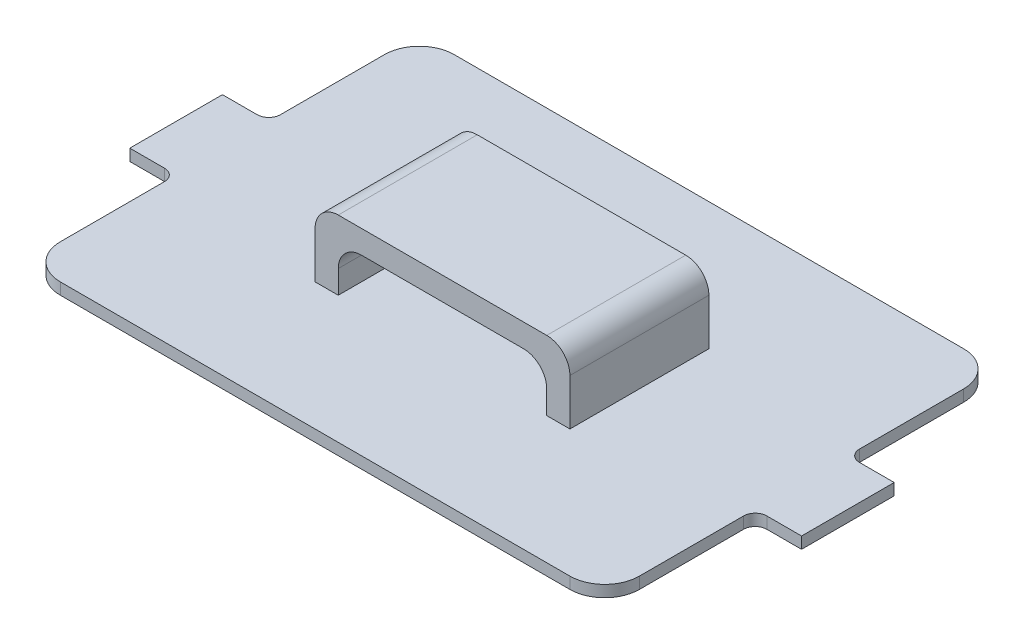
ISO-10303-21;
HEADER;
FILE_DESCRIPTION(('STEP AP214'),'2;1');
FILE_NAME('part.step','',(''),(''),'','','');
FILE_SCHEMA(('AUTOMOTIVE_DESIGN { 1 0 10303 214 1 1 1 1 }'));
ENDSEC;
DATA;
#1=APPLICATION_CONTEXT('core data for automotive mechanical design processes');
#2=APPLICATION_PROTOCOL_DEFINITION('international standard','automotive_design',2000,#1);
#3=PRODUCT_CONTEXT('',#1,'mechanical');
#4=PRODUCT('Part','Part','',(#3));
#5=PRODUCT_RELATED_PRODUCT_CATEGORY('part','',(#4));
#6=PRODUCT_DEFINITION_FORMATION('','',#4);
#7=PRODUCT_DEFINITION_CONTEXT('part definition',#1,'design');
#8=PRODUCT_DEFINITION('design','',#6,#7);
#9=PRODUCT_DEFINITION_SHAPE('','',#8);
#10=(LENGTH_UNIT() NAMED_UNIT(*) SI_UNIT(.MILLI.,.METRE.));
#11=(NAMED_UNIT(*) PLANE_ANGLE_UNIT() SI_UNIT($,.RADIAN.));
#12=(NAMED_UNIT(*) SI_UNIT($,.STERADIAN.) SOLID_ANGLE_UNIT());
#13=UNCERTAINTY_MEASURE_WITH_UNIT(LENGTH_MEASURE(1.E-05),#10,'distance_accuracy_value','');
#14=(GEOMETRIC_REPRESENTATION_CONTEXT(3) GLOBAL_UNCERTAINTY_ASSIGNED_CONTEXT((#13)) GLOBAL_UNIT_ASSIGNED_CONTEXT((#10,
#11,#12)) REPRESENTATION_CONTEXT('',''));
#15=CARTESIAN_POINT('',(0.,0.,0.));
#16=DIRECTION('',(0.,0.,1.));
#17=DIRECTION('',(1.,0.,0.));
#18=AXIS2_PLACEMENT_3D('',#15,#16,#17);
#19=CARTESIAN_POINT('',(40.,17.5,0.));
#20=DIRECTION('',(-1.,0.,0.));
#21=DIRECTION('',(0.,0.,1.));
#22=AXIS2_PLACEMENT_3D('',#19,#20,#21);
#23=PLANE('',#22);
#24=DIRECTION('',(0.,-1.,0.));
#25=VECTOR('',#24,1.);
#26=CARTESIAN_POINT('',(40.,17.5,-57.5));
#27=LINE('',#26,#25);
#28=CARTESIAN_POINT('',(40.,7.5,-57.5));
#29=VERTEX_POINT('',#28);
#30=CARTESIAN_POINT('',(40.,2.5,-57.5));
#31=VERTEX_POINT('',#30);
#32=EDGE_CURVE('E323',#29,#31,#27,.T.);
#33=ORIENTED_EDGE('',*,*,#32,.F.);
#34=DIRECTION('',(0.,0.,-1.));
#35=VECTOR('',#34,1.);
#36=CARTESIAN_POINT('',(40.,7.5,-27.5));
#37=LINE('',#36,#35);
#38=CARTESIAN_POINT('',(40.,7.5,-27.5));
#39=VERTEX_POINT('',#38);
#40=EDGE_CURVE('E536',#29,#39,#37,.F.);
#41=ORIENTED_EDGE('',*,*,#40,.T.);
#42=DIRECTION('',(0.,-1.,0.));
#43=VECTOR('',#42,1.);
#44=CARTESIAN_POINT('',(40.,17.5,-27.5));
#45=LINE('',#44,#43);
#46=CARTESIAN_POINT('',(40.,2.5,-27.5));
#47=VERTEX_POINT('',#46);
#48=EDGE_CURVE('E326',#39,#47,#45,.T.);
#49=ORIENTED_EDGE('',*,*,#48,.T.);
#50=DIRECTION('',(0.,0.,-1.));
#51=VECTOR('',#50,1.);
#52=CARTESIAN_POINT('',(40.,2.5,0.));
#53=LINE('',#52,#51);
#54=EDGE_CURVE('E314',#47,#31,#53,.T.);
#55=ORIENTED_EDGE('',*,*,#54,.T.);
#56=EDGE_LOOP('',(#33,#41,#49,#55));
#57=FACE_BOUND('',#56,.T.);
#58=ADVANCED_FACE('F43',(#57),#23,.F.);
#59=CARTESIAN_POINT('',(85.,17.5,0.));
#60=DIRECTION('',(-1.,0.,0.));
#61=DIRECTION('',(0.,0.,1.));
#62=AXIS2_PLACEMENT_3D('',#59,#60,#61);
#63=PLANE('',#62);
#64=DIRECTION('',(0.,-1.,0.));
#65=VECTOR('',#64,1.);
#66=CARTESIAN_POINT('',(85.,17.5,-27.5));
#67=LINE('',#66,#65);
#68=CARTESIAN_POINT('',(85.,7.5,-27.5));
#69=VERTEX_POINT('',#68);
#70=CARTESIAN_POINT('',(85.,2.5,-27.5));
#71=VERTEX_POINT('',#70);
#72=EDGE_CURVE('E294',#69,#71,#67,.T.);
#73=ORIENTED_EDGE('',*,*,#72,.F.);
#74=DIRECTION('',(0.,0.,1.));
#75=VECTOR('',#74,1.);
#76=CARTESIAN_POINT('',(85.,7.5,0.));
#77=LINE('',#76,#75);
#78=CARTESIAN_POINT('',(85.,7.5,-57.5));
#79=VERTEX_POINT('',#78);
#80=EDGE_CURVE('E260',#69,#79,#77,.F.);
#81=ORIENTED_EDGE('',*,*,#80,.T.);
#82=DIRECTION('',(0.,-1.,0.));
#83=VECTOR('',#82,1.);
#84=CARTESIAN_POINT('',(85.,17.5,-57.5));
#85=LINE('',#84,#83);
#86=CARTESIAN_POINT('',(85.,2.5,-57.5));
#87=VERTEX_POINT('',#86);
#88=EDGE_CURVE('E254',#79,#87,#85,.T.);
#89=ORIENTED_EDGE('',*,*,#88,.T.);
#90=DIRECTION('',(0.,0.,-1.));
#91=VECTOR('',#90,1.);
#92=CARTESIAN_POINT('',(85.,2.5,0.));
#93=LINE('',#92,#91);
#94=EDGE_CURVE('E258',#71,#87,#93,.T.);
#95=ORIENTED_EDGE('',*,*,#94,.F.);
#96=EDGE_LOOP('',(#73,#81,#89,#95));
#97=FACE_BOUND('',#96,.T.);
#98=ADVANCED_FACE('F257',(#97),#63,.T.);
#99=CARTESIAN_POINT('',(0.,2.5,0.));
#100=DIRECTION('',(1.,0.,0.));
#101=DIRECTION('',(0.,0.,-1.));
#102=AXIS2_PLACEMENT_3D('',#99,#100,#101);
#103=PLANE('',#102);
#104=DIRECTION('',(0.,0.,1.));
#105=VECTOR('',#104,1.);
#106=CARTESIAN_POINT('',(0.,0.,0.));
#107=LINE('',#106,#105);
#108=CARTESIAN_POINT('',(0.,0.,-30.));
#109=VERTEX_POINT('',#108);
#110=CARTESIAN_POINT('',(0.,0.,-7.5));
#111=VERTEX_POINT('',#110);
#112=EDGE_CURVE('E385',#109,#111,#107,.T.);
#113=ORIENTED_EDGE('',*,*,#112,.T.);
#114=DIRECTION('',(0.,-1.,0.));
#115=VECTOR('',#114,1.);
#116=CARTESIAN_POINT('',(0.,2.5,-7.5));
#117=LINE('',#116,#115);
#118=CARTESIAN_POINT('',(0.,2.5,-7.5));
#119=VERTEX_POINT('',#118);
#120=EDGE_CURVE('E519',#111,#119,#117,.F.);
#121=ORIENTED_EDGE('',*,*,#120,.T.);
#122=DIRECTION('',(0.,0.,1.));
#123=VECTOR('',#122,1.);
#124=CARTESIAN_POINT('',(0.,2.5,0.));
#125=LINE('',#124,#123);
#126=CARTESIAN_POINT('',(0.,2.5,-30.));
#127=VERTEX_POINT('',#126);
#128=EDGE_CURVE('E393',#127,#119,#125,.T.);
#129=ORIENTED_EDGE('',*,*,#128,.F.);
#130=DIRECTION('',(0.,1.,0.));
#131=VECTOR('',#130,1.);
#132=CARTESIAN_POINT('',(0.,0.,-30.));
#133=LINE('',#132,#131);
#134=EDGE_CURVE('E445',#127,#109,#133,.F.);
#135=ORIENTED_EDGE('',*,*,#134,.T.);
#136=EDGE_LOOP('',(#113,#121,#129,#135));
#137=FACE_BOUND('',#136,.T.);
#138=ADVANCED_FACE('F671',(#137),#103,.F.);
#139=CARTESIAN_POINT('',(125.,2.5,0.));
#140=DIRECTION('',(-1.,0.,0.));
#141=DIRECTION('',(0.,0.,1.));
#142=AXIS2_PLACEMENT_3D('',#139,#140,#141);
#143=PLANE('',#142);
#144=DIRECTION('',(0.,0.,-1.));
#145=VECTOR('',#144,1.);
#146=CARTESIAN_POINT('',(125.,0.,0.));
#147=LINE('',#146,#145);
#148=CARTESIAN_POINT('',(125.,0.,-55.));
#149=VERTEX_POINT('',#148);
#150=CARTESIAN_POINT('',(125.,0.,-77.5));
#151=VERTEX_POINT('',#150);
#152=EDGE_CURVE('E413',#149,#151,#147,.T.);
#153=ORIENTED_EDGE('',*,*,#152,.T.);
#154=DIRECTION('',(0.,-1.,0.));
#155=VECTOR('',#154,1.);
#156=CARTESIAN_POINT('',(125.,2.5,-77.5));
#157=LINE('',#156,#155);
#158=CARTESIAN_POINT('',(125.,2.5,-77.5));
#159=VERTEX_POINT('',#158);
#160=EDGE_CURVE('E493',#151,#159,#157,.F.);
#161=ORIENTED_EDGE('',*,*,#160,.T.);
#162=DIRECTION('',(0.,0.,-1.));
#163=VECTOR('',#162,1.);
#164=CARTESIAN_POINT('',(125.,2.5,0.));
#165=LINE('',#164,#163);
#166=CARTESIAN_POINT('',(125.,2.5,-55.));
#167=VERTEX_POINT('',#166);
#168=EDGE_CURVE('E397',#167,#159,#165,.T.);
#169=ORIENTED_EDGE('',*,*,#168,.F.);
#170=DIRECTION('',(0.,1.,0.));
#171=VECTOR('',#170,1.);
#172=CARTESIAN_POINT('',(125.,0.,-55.));
#173=LINE('',#172,#171);
#174=EDGE_CURVE('E424',#167,#149,#173,.F.);
#175=ORIENTED_EDGE('',*,*,#174,.T.);
#176=EDGE_LOOP('',(#153,#161,#169,#175));
#177=FACE_BOUND('',#176,.T.);
#178=ADVANCED_FACE('F716',(#177),#143,.F.);
#179=CARTESIAN_POINT('',(0.,2.5,-77.5));
#180=VERTEX_POINT('',#179);
#181=CARTESIAN_POINT('',(0.,2.5,-55.));
#182=VERTEX_POINT('',#181);
#183=EDGE_CURVE('E389',#180,#182,#125,.T.);
#184=ORIENTED_EDGE('',*,*,#183,.F.);
#185=DIRECTION('',(0.,-1.,0.));
#186=VECTOR('',#185,1.);
#187=CARTESIAN_POINT('',(0.,2.5,-77.5));
#188=LINE('',#187,#186);
#189=CARTESIAN_POINT('',(0.,0.,-77.5));
#190=VERTEX_POINT('',#189);
#191=EDGE_CURVE('E522',#180,#190,#188,.T.);
#192=ORIENTED_EDGE('',*,*,#191,.T.);
#193=CARTESIAN_POINT('',(0.,0.,-55.));
#194=VERTEX_POINT('',#193);
#195=EDGE_CURVE('E406',#190,#194,#107,.T.);
#196=ORIENTED_EDGE('',*,*,#195,.T.);
#197=DIRECTION('',(0.,1.,0.));
#198=VECTOR('',#197,1.);
#199=CARTESIAN_POINT('',(0.,2.5,-55.));
#200=LINE('',#199,#198);
#201=EDGE_CURVE('E434',#194,#182,#200,.T.);
#202=ORIENTED_EDGE('',*,*,#201,.T.);
#203=EDGE_LOOP('',(#184,#192,#196,#202));
#204=FACE_BOUND('',#203,.T.);
#205=ADVANCED_FACE('F640',(#204),#103,.F.);
#206=CARTESIAN_POINT('',(0.,2.5,0.));
#207=DIRECTION('',(0.,0.,-1.));
#208=DIRECTION('',(-1.,0.,0.));
#209=AXIS2_PLACEMENT_3D('',#206,#207,#208);
#210=PLANE('',#209);
#211=DIRECTION('',(1.,0.,0.));
#212=VECTOR('',#211,1.);
#213=CARTESIAN_POINT('',(0.,0.,0.));
#214=LINE('',#213,#212);
#215=CARTESIAN_POINT('',(7.5,0.,0.));
#216=VERTEX_POINT('',#215);
#217=CARTESIAN_POINT('',(117.5,0.,0.));
#218=VERTEX_POINT('',#217);
#219=EDGE_CURVE('E409',#216,#218,#214,.T.);
#220=ORIENTED_EDGE('',*,*,#219,.T.);
#221=DIRECTION('',(0.,-1.,0.));
#222=VECTOR('',#221,1.);
#223=CARTESIAN_POINT('',(117.5,2.5,0.));
#224=LINE('',#223,#222);
#225=CARTESIAN_POINT('',(117.5,2.5,0.));
#226=VERTEX_POINT('',#225);
#227=EDGE_CURVE('E516',#218,#226,#224,.F.);
#228=ORIENTED_EDGE('',*,*,#227,.T.);
#229=DIRECTION('',(1.,0.,0.));
#230=VECTOR('',#229,1.);
#231=CARTESIAN_POINT('',(0.,2.5,0.));
#232=LINE('',#231,#230);
#233=CARTESIAN_POINT('',(7.5,2.5,0.));
#234=VERTEX_POINT('',#233);
#235=EDGE_CURVE('E392',#234,#226,#232,.T.);
#236=ORIENTED_EDGE('',*,*,#235,.F.);
#237=DIRECTION('',(0.,-1.,0.));
#238=VECTOR('',#237,1.);
#239=CARTESIAN_POINT('',(7.5,2.5,0.));
#240=LINE('',#239,#238);
#241=EDGE_CURVE('E512',#234,#216,#240,.T.);
#242=ORIENTED_EDGE('',*,*,#241,.T.);
#243=EDGE_LOOP('',(#220,#228,#236,#242));
#244=FACE_BOUND('',#243,.T.);
#245=ADVANCED_FACE('F683',(#244),#210,.F.);
#246=CARTESIAN_POINT('',(125.,2.5,-7.5));
#247=VERTEX_POINT('',#246);
#248=CARTESIAN_POINT('',(125.,2.5,-30.));
#249=VERTEX_POINT('',#248);
#250=EDGE_CURVE('E398',#247,#249,#165,.T.);
#251=ORIENTED_EDGE('',*,*,#250,.F.);
#252=DIRECTION('',(0.,-1.,0.));
#253=VECTOR('',#252,1.);
#254=CARTESIAN_POINT('',(125.,2.5,-7.5));
#255=LINE('',#254,#253);
#256=CARTESIAN_POINT('',(125.,0.,-7.5));
#257=VERTEX_POINT('',#256);
#258=EDGE_CURVE('E508',#247,#257,#255,.T.);
#259=ORIENTED_EDGE('',*,*,#258,.T.);
#260=CARTESIAN_POINT('',(125.,0.,-30.));
#261=VERTEX_POINT('',#260);
#262=EDGE_CURVE('E414',#257,#261,#147,.T.);
#263=ORIENTED_EDGE('',*,*,#262,.T.);
#264=DIRECTION('',(0.,1.,0.));
#265=VECTOR('',#264,1.);
#266=CARTESIAN_POINT('',(125.,2.5,-30.));
#267=LINE('',#266,#265);
#268=EDGE_CURVE('E427',#261,#249,#267,.T.);
#269=ORIENTED_EDGE('',*,*,#268,.T.);
#270=EDGE_LOOP('',(#251,#259,#263,#269));
#271=FACE_BOUND('',#270,.T.);
#272=ADVANCED_FACE('F692',(#271),#143,.F.);
#273=CARTESIAN_POINT('',(0.,2.5,-85.));
#274=DIRECTION('',(0.,0.,1.));
#275=DIRECTION('',(1.,0.,0.));
#276=AXIS2_PLACEMENT_3D('',#273,#274,#275);
#277=PLANE('',#276);
#278=DIRECTION('',(-1.,0.,0.));
#279=VECTOR('',#278,1.);
#280=CARTESIAN_POINT('',(0.,2.5,-85.));
#281=LINE('',#280,#279);
#282=CARTESIAN_POINT('',(117.5,2.5,-85.));
#283=VERTEX_POINT('',#282);
#284=CARTESIAN_POINT('',(7.5,2.5,-85.));
#285=VERTEX_POINT('',#284);
#286=EDGE_CURVE('E401',#283,#285,#281,.T.);
#287=ORIENTED_EDGE('',*,*,#286,.F.);
#288=DIRECTION('',(0.,-1.,0.));
#289=VECTOR('',#288,1.);
#290=CARTESIAN_POINT('',(117.5,2.5,-85.));
#291=LINE('',#290,#289);
#292=CARTESIAN_POINT('',(117.5,0.,-85.));
#293=VERTEX_POINT('',#292);
#294=EDGE_CURVE('E477',#283,#293,#291,.T.);
#295=ORIENTED_EDGE('',*,*,#294,.T.);
#296=DIRECTION('',(-1.,0.,0.));
#297=VECTOR('',#296,1.);
#298=CARTESIAN_POINT('',(0.,0.,-85.));
#299=LINE('',#298,#297);
#300=CARTESIAN_POINT('',(7.5,0.,-85.));
#301=VERTEX_POINT('',#300);
#302=EDGE_CURVE('E417',#293,#301,#299,.T.);
#303=ORIENTED_EDGE('',*,*,#302,.T.);
#304=DIRECTION('',(0.,-1.,0.));
#305=VECTOR('',#304,1.);
#306=CARTESIAN_POINT('',(7.5,2.5,-85.));
#307=LINE('',#306,#305);
#308=EDGE_CURVE('E474',#301,#285,#307,.F.);
#309=ORIENTED_EDGE('',*,*,#308,.T.);
#310=EDGE_LOOP('',(#287,#295,#303,#309));
#311=FACE_BOUND('',#310,.T.);
#312=ADVANCED_FACE('F613',(#311),#277,.F.);
#313=CARTESIAN_POINT('',(0.,2.5,0.));
#314=DIRECTION('',(0.,-1.,0.));
#315=DIRECTION('',(0.,0.,-1.));
#316=AXIS2_PLACEMENT_3D('',#313,#314,#315);
#317=PLANE('',#316);
#318=DIRECTION('',(-1.,0.,0.));
#319=VECTOR('',#318,1.);
#320=CARTESIAN_POINT('',(1.71737624121708E-13,2.5,-27.5000000000005));
#321=LINE('',#320,#319);
#322=CARTESIAN_POINT('',(90.,2.5,-27.5));
#323=VERTEX_POINT('',#322);
#324=EDGE_CURVE('E276',#323,#71,#321,.T.);
#325=ORIENTED_EDGE('',*,*,#324,.T.);
#326=ORIENTED_EDGE('',*,*,#94,.T.);
#327=DIRECTION('',(-1.,0.,0.));
#328=VECTOR('',#327,1.);
#329=CARTESIAN_POINT('',(2.39391839684801E-13,2.5,-57.5000000000004));
#330=LINE('',#329,#328);
#331=CARTESIAN_POINT('',(90.,2.5,-57.5));
#332=VERTEX_POINT('',#331);
#333=EDGE_CURVE('E266',#332,#87,#330,.T.);
#334=ORIENTED_EDGE('',*,*,#333,.F.);
#335=DIRECTION('',(0.,0.,-1.));
#336=VECTOR('',#335,1.);
#337=CARTESIAN_POINT('',(89.9999999999999,2.5,0.));
#338=LINE('',#337,#336);
#339=EDGE_CURVE('E283',#323,#332,#338,.T.);
#340=ORIENTED_EDGE('',*,*,#339,.F.);
#341=EDGE_LOOP('',(#325,#326,#334,#340));
#342=FACE_BOUND('',#341,.T.);
#343=DIRECTION('',(1.,0.,0.));
#344=VECTOR('',#343,1.);
#345=CARTESIAN_POINT('',(0.,2.5,-27.4999999999999));
#346=LINE('',#345,#344);
#347=CARTESIAN_POINT('',(35.,2.5,-27.5));
#348=VERTEX_POINT('',#347);
#349=EDGE_CURVE('E310',#348,#47,#346,.T.);
#350=ORIENTED_EDGE('',*,*,#349,.F.);
#351=DIRECTION('',(0.,0.,-1.));
#352=VECTOR('',#351,1.);
#353=CARTESIAN_POINT('',(35.,2.5,0.));
#354=LINE('',#353,#352);
#355=CARTESIAN_POINT('',(35.,2.5,-57.5));
#356=VERTEX_POINT('',#355);
#357=EDGE_CURVE('E297',#348,#356,#354,.T.);
#358=ORIENTED_EDGE('',*,*,#357,.T.);
#359=DIRECTION('',(1.,0.,0.));
#360=VECTOR('',#359,1.);
#361=CARTESIAN_POINT('',(0.,2.5,-57.5));
#362=LINE('',#361,#360);
#363=EDGE_CURVE('E303',#356,#31,#362,.T.);
#364=ORIENTED_EDGE('',*,*,#363,.T.);
#365=ORIENTED_EDGE('',*,*,#54,.F.);
#366=EDGE_LOOP('',(#350,#358,#364,#365));
#367=FACE_BOUND('',#366,.T.);
#368=ORIENTED_EDGE('',*,*,#168,.T.);
#369=CARTESIAN_POINT('',(117.5,2.5,-77.5));
#370=DIRECTION('',(0.,-1.,0.));
#371=DIRECTION('',(0.,0.,-1.));
#372=AXIS2_PLACEMENT_3D('',#369,#370,#371);
#373=CIRCLE('',#372,7.5);
#374=EDGE_CURVE('E505',#159,#283,#373,.F.);
#375=ORIENTED_EDGE('',*,*,#374,.T.);
#376=ORIENTED_EDGE('',*,*,#286,.T.);
#377=CARTESIAN_POINT('',(7.5,2.5,-77.5));
#378=DIRECTION('',(0.,-1.,0.));
#379=DIRECTION('',(0.,0.,-1.));
#380=AXIS2_PLACEMENT_3D('',#377,#378,#379);
#381=CIRCLE('',#380,7.5);
#382=EDGE_CURVE('E496',#285,#180,#381,.F.);
#383=ORIENTED_EDGE('',*,*,#382,.T.);
#384=ORIENTED_EDGE('',*,*,#183,.T.);
#385=CARTESIAN_POINT('',(-2.5,2.5,-55.));
#386=DIRECTION('',(0.,-1.,0.));
#387=DIRECTION('',(0.,0.,-1.));
#388=AXIS2_PLACEMENT_3D('',#385,#386,#387);
#389=CIRCLE('',#388,2.5);
#390=CARTESIAN_POINT('',(-2.5,2.5,-52.5));
#391=VERTEX_POINT('',#390);
#392=EDGE_CURVE('E461',#182,#391,#389,.T.);
#393=ORIENTED_EDGE('',*,*,#392,.T.);
#394=DIRECTION('',(-1.,0.,0.));
#395=VECTOR('',#394,1.);
#396=CARTESIAN_POINT('',(0.,2.5,-52.5));
#397=LINE('',#396,#395);
#398=CARTESIAN_POINT('',(-10.,2.5,-52.5));
#399=VERTEX_POINT('',#398);
#400=EDGE_CURVE('E347',#391,#399,#397,.T.);
#401=ORIENTED_EDGE('',*,*,#400,.T.);
#402=DIRECTION('',(0.,0.,-1.));
#403=VECTOR('',#402,1.);
#404=CARTESIAN_POINT('',(-10.,2.5,0.));
#405=LINE('',#404,#403);
#406=CARTESIAN_POINT('',(-10.,2.5,-32.5));
#407=VERTEX_POINT('',#406);
#408=EDGE_CURVE('E337',#407,#399,#405,.T.);
#409=ORIENTED_EDGE('',*,*,#408,.F.);
#410=DIRECTION('',(-1.,0.,0.));
#411=VECTOR('',#410,1.);
#412=CARTESIAN_POINT('',(0.,2.5,-32.5));
#413=LINE('',#412,#411);
#414=CARTESIAN_POINT('',(-2.5,2.5,-32.5));
#415=VERTEX_POINT('',#414);
#416=EDGE_CURVE('E332',#415,#407,#413,.T.);
#417=ORIENTED_EDGE('',*,*,#416,.F.);
#418=CARTESIAN_POINT('',(-2.5,2.5,-30.));
#419=DIRECTION('',(0.,-1.,0.));
#420=DIRECTION('',(0.,0.,-1.));
#421=AXIS2_PLACEMENT_3D('',#418,#419,#420);
#422=CIRCLE('',#421,2.5);
#423=EDGE_CURVE('E468',#415,#127,#422,.T.);
#424=ORIENTED_EDGE('',*,*,#423,.T.);
#425=ORIENTED_EDGE('',*,*,#128,.T.);
#426=CARTESIAN_POINT('',(7.5,2.5,-7.5));
#427=DIRECTION('',(0.,-1.,0.));
#428=DIRECTION('',(0.,0.,-1.));
#429=AXIS2_PLACEMENT_3D('',#426,#427,#428);
#430=CIRCLE('',#429,7.5);
#431=EDGE_CURVE('E499',#119,#234,#430,.F.);
#432=ORIENTED_EDGE('',*,*,#431,.T.);
#433=ORIENTED_EDGE('',*,*,#235,.T.);
#434=CARTESIAN_POINT('',(117.5,2.5,-7.5));
#435=DIRECTION('',(0.,-1.,0.));
#436=DIRECTION('',(0.,0.,-1.));
#437=AXIS2_PLACEMENT_3D('',#434,#435,#436);
#438=CIRCLE('',#437,7.5);
#439=EDGE_CURVE('E502',#226,#247,#438,.F.);
#440=ORIENTED_EDGE('',*,*,#439,.T.);
#441=ORIENTED_EDGE('',*,*,#250,.T.);
#442=CARTESIAN_POINT('',(127.5,2.5,-30.));
#443=DIRECTION('',(0.,-1.,0.));
#444=DIRECTION('',(0.,0.,-1.));
#445=AXIS2_PLACEMENT_3D('',#442,#443,#444);
#446=CIRCLE('',#445,2.5);
#447=CARTESIAN_POINT('',(127.5,2.5,-32.5));
#448=VERTEX_POINT('',#447);
#449=EDGE_CURVE('E454',#249,#448,#446,.T.);
#450=ORIENTED_EDGE('',*,*,#449,.T.);
#451=DIRECTION('',(1.,0.,0.));
#452=VECTOR('',#451,1.);
#453=CARTESIAN_POINT('',(0.,2.5,-32.5));
#454=LINE('',#453,#452);
#455=CARTESIAN_POINT('',(135.,2.5,-32.5));
#456=VERTEX_POINT('',#455);
#457=EDGE_CURVE('E357',#448,#456,#454,.T.);
#458=ORIENTED_EDGE('',*,*,#457,.T.);
#459=DIRECTION('',(0.,0.,-1.));
#460=VECTOR('',#459,1.);
#461=CARTESIAN_POINT('',(135.,2.5,0.));
#462=LINE('',#461,#460);
#463=CARTESIAN_POINT('',(135.,2.5,-52.5));
#464=VERTEX_POINT('',#463);
#465=EDGE_CURVE('E375',#456,#464,#462,.T.);
#466=ORIENTED_EDGE('',*,*,#465,.T.);
#467=DIRECTION('',(1.,0.,0.));
#468=VECTOR('',#467,1.);
#469=CARTESIAN_POINT('',(0.,2.5,-52.5));
#470=LINE('',#469,#468);
#471=CARTESIAN_POINT('',(127.5,2.5,-52.5));
#472=VERTEX_POINT('',#471);
#473=EDGE_CURVE('E365',#472,#464,#470,.T.);
#474=ORIENTED_EDGE('',*,*,#473,.F.);
#475=CARTESIAN_POINT('',(127.5,2.5,-55.));
#476=DIRECTION('',(0.,-1.,0.));
#477=DIRECTION('',(0.,0.,-1.));
#478=AXIS2_PLACEMENT_3D('',#475,#476,#477);
#479=CIRCLE('',#478,2.5);
#480=EDGE_CURVE('E448',#472,#167,#479,.T.);
#481=ORIENTED_EDGE('',*,*,#480,.T.);
#482=EDGE_LOOP('',(#368,#375,#376,#383,#384,#393,#401,#409,#417,#424,#425,#432,#433,#440,#441,
#450,#458,#466,#474,#481));
#483=FACE_BOUND('',#482,.T.);
#484=ADVANCED_FACE('F271',(#342,#367,#483),#317,.F.);
#485=CARTESIAN_POINT('',(0.,0.,0.));
#486=DIRECTION('',(0.,-1.,0.));
#487=DIRECTION('',(0.,0.,-1.));
#488=AXIS2_PLACEMENT_3D('',#485,#486,#487);
#489=PLANE('',#488);
#490=ORIENTED_EDGE('',*,*,#302,.F.);
#491=CARTESIAN_POINT('',(117.5,0.,-77.5));
#492=DIRECTION('',(0.,-1.,0.));
#493=DIRECTION('',(0.,0.,-1.));
#494=AXIS2_PLACEMENT_3D('',#491,#492,#493);
#495=CIRCLE('',#494,7.5);
#496=EDGE_CURVE('E490',#293,#151,#495,.T.);
#497=ORIENTED_EDGE('',*,*,#496,.T.);
#498=ORIENTED_EDGE('',*,*,#152,.F.);
#499=CARTESIAN_POINT('',(127.5,0.,-55.));
#500=DIRECTION('',(0.,-1.,0.));
#501=DIRECTION('',(0.,0.,-1.));
#502=AXIS2_PLACEMENT_3D('',#499,#500,#501);
#503=CIRCLE('',#502,2.5);
#504=CARTESIAN_POINT('',(127.5,0.,-52.5));
#505=VERTEX_POINT('',#504);
#506=EDGE_CURVE('E451',#149,#505,#503,.F.);
#507=ORIENTED_EDGE('',*,*,#506,.T.);
#508=DIRECTION('',(1.,0.,0.));
#509=VECTOR('',#508,1.);
#510=CARTESIAN_POINT('',(0.,0.,-52.5));
#511=LINE('',#510,#509);
#512=CARTESIAN_POINT('',(135.,0.,-52.5));
#513=VERTEX_POINT('',#512);
#514=EDGE_CURVE('E369',#505,#513,#511,.T.);
#515=ORIENTED_EDGE('',*,*,#514,.T.);
#516=DIRECTION('',(0.,0.,-1.));
#517=VECTOR('',#516,1.);
#518=CARTESIAN_POINT('',(135.,0.,0.));
#519=LINE('',#518,#517);
#520=CARTESIAN_POINT('',(135.,0.,-32.5));
#521=VERTEX_POINT('',#520);
#522=EDGE_CURVE('E364',#521,#513,#519,.T.);
#523=ORIENTED_EDGE('',*,*,#522,.F.);
#524=DIRECTION('',(1.,0.,0.));
#525=VECTOR('',#524,1.);
#526=CARTESIAN_POINT('',(0.,0.,-32.5));
#527=LINE('',#526,#525);
#528=CARTESIAN_POINT('',(127.5,0.,-32.5));
#529=VERTEX_POINT('',#528);
#530=EDGE_CURVE('E361',#529,#521,#527,.T.);
#531=ORIENTED_EDGE('',*,*,#530,.F.);
#532=CARTESIAN_POINT('',(127.5,0.,-30.));
#533=DIRECTION('',(0.,-1.,0.));
#534=DIRECTION('',(0.,0.,-1.));
#535=AXIS2_PLACEMENT_3D('',#532,#533,#534);
#536=CIRCLE('',#535,2.5);
#537=EDGE_CURVE('E457',#529,#261,#536,.F.);
#538=ORIENTED_EDGE('',*,*,#537,.T.);
#539=ORIENTED_EDGE('',*,*,#262,.F.);
#540=CARTESIAN_POINT('',(117.5,0.,-7.5));
#541=DIRECTION('',(0.,-1.,0.));
#542=DIRECTION('',(0.,0.,-1.));
#543=AXIS2_PLACEMENT_3D('',#540,#541,#542);
#544=CIRCLE('',#543,7.5);
#545=EDGE_CURVE('E487',#257,#218,#544,.T.);
#546=ORIENTED_EDGE('',*,*,#545,.T.);
#547=ORIENTED_EDGE('',*,*,#219,.F.);
#548=CARTESIAN_POINT('',(7.5,0.,-7.5));
#549=DIRECTION('',(0.,-1.,0.));
#550=DIRECTION('',(0.,0.,-1.));
#551=AXIS2_PLACEMENT_3D('',#548,#549,#550);
#552=CIRCLE('',#551,7.5);
#553=EDGE_CURVE('E484',#216,#111,#552,.T.);
#554=ORIENTED_EDGE('',*,*,#553,.T.);
#555=ORIENTED_EDGE('',*,*,#112,.F.);
#556=CARTESIAN_POINT('',(-2.5,0.,-30.));
#557=DIRECTION('',(0.,-1.,0.));
#558=DIRECTION('',(0.,0.,-1.));
#559=AXIS2_PLACEMENT_3D('',#556,#557,#558);
#560=CIRCLE('',#559,2.5);
#561=CARTESIAN_POINT('',(-2.5,0.,-32.5));
#562=VERTEX_POINT('',#561);
#563=EDGE_CURVE('E471',#109,#562,#560,.F.);
#564=ORIENTED_EDGE('',*,*,#563,.T.);
#565=DIRECTION('',(-1.,0.,0.));
#566=VECTOR('',#565,1.);
#567=CARTESIAN_POINT('',(0.,0.,-32.5));
#568=LINE('',#567,#566);
#569=CARTESIAN_POINT('',(-10.,0.,-32.5));
#570=VERTEX_POINT('',#569);
#571=EDGE_CURVE('E333',#562,#570,#568,.T.);
#572=ORIENTED_EDGE('',*,*,#571,.T.);
#573=DIRECTION('',(0.,0.,-1.));
#574=VECTOR('',#573,1.);
#575=CARTESIAN_POINT('',(-10.,0.,0.));
#576=LINE('',#575,#574);
#577=CARTESIAN_POINT('',(-10.,0.,-52.5));
#578=VERTEX_POINT('',#577);
#579=EDGE_CURVE('E340',#570,#578,#576,.T.);
#580=ORIENTED_EDGE('',*,*,#579,.T.);
#581=DIRECTION('',(-1.,0.,0.));
#582=VECTOR('',#581,1.);
#583=CARTESIAN_POINT('',(0.,0.,-52.5));
#584=LINE('',#583,#582);
#585=CARTESIAN_POINT('',(-2.5,0.,-52.5));
#586=VERTEX_POINT('',#585);
#587=EDGE_CURVE('E336',#586,#578,#584,.T.);
#588=ORIENTED_EDGE('',*,*,#587,.F.);
#589=CARTESIAN_POINT('',(-2.5,0.,-55.));
#590=DIRECTION('',(0.,-1.,0.));
#591=DIRECTION('',(0.,0.,-1.));
#592=AXIS2_PLACEMENT_3D('',#589,#590,#591);
#593=CIRCLE('',#592,2.5);
#594=EDGE_CURVE('E464',#586,#194,#593,.F.);
#595=ORIENTED_EDGE('',*,*,#594,.T.);
#596=ORIENTED_EDGE('',*,*,#195,.F.);
#597=CARTESIAN_POINT('',(7.5,0.,-77.5));
#598=DIRECTION('',(0.,-1.,0.));
#599=DIRECTION('',(0.,0.,-1.));
#600=AXIS2_PLACEMENT_3D('',#597,#598,#599);
#601=CIRCLE('',#600,7.5);
#602=EDGE_CURVE('E481',#190,#301,#601,.T.);
#603=ORIENTED_EDGE('',*,*,#602,.T.);
#604=EDGE_LOOP('',(#490,#497,#498,#507,#515,#523,#531,#538,#539,#546,#547,#554,#555,#564,#572,
#580,#588,#595,#596,#603));
#605=FACE_BOUND('',#604,.T.);
#606=ADVANCED_FACE('F612',(#605),#489,.T.);
#607=CARTESIAN_POINT('',(0.,0.,-52.5));
#608=DIRECTION('',(0.,0.,1.));
#609=DIRECTION('',(1.,0.,0.));
#610=AXIS2_PLACEMENT_3D('',#607,#608,#609);
#611=PLANE('',#610);
#612=ORIENTED_EDGE('',*,*,#514,.F.);
#613=DIRECTION('',(0.,1.,0.));
#614=VECTOR('',#613,1.);
#615=CARTESIAN_POINT('',(127.5,2.5,-52.5));
#616=LINE('',#615,#614);
#617=EDGE_CURVE('E405',#505,#472,#616,.T.);
#618=ORIENTED_EDGE('',*,*,#617,.T.);
#619=ORIENTED_EDGE('',*,*,#473,.T.);
#620=DIRECTION('',(0.,1.,0.));
#621=VECTOR('',#620,1.);
#622=CARTESIAN_POINT('',(135.,0.,-52.5));
#623=LINE('',#622,#621);
#624=EDGE_CURVE('E381',#513,#464,#623,.T.);
#625=ORIENTED_EDGE('',*,*,#624,.F.);
#626=EDGE_LOOP('',(#612,#618,#619,#625));
#627=FACE_BOUND('',#626,.T.);
#628=ADVANCED_FACE('F711',(#627),#611,.F.);
#629=CARTESIAN_POINT('',(135.,0.,0.));
#630=DIRECTION('',(1.,0.,0.));
#631=DIRECTION('',(0.,0.,-1.));
#632=AXIS2_PLACEMENT_3D('',#629,#630,#631);
#633=PLANE('',#632);
#634=ORIENTED_EDGE('',*,*,#465,.F.);
#635=DIRECTION('',(0.,1.,0.));
#636=VECTOR('',#635,1.);
#637=CARTESIAN_POINT('',(135.,0.,-32.5));
#638=LINE('',#637,#636);
#639=EDGE_CURVE('E372',#521,#456,#638,.T.);
#640=ORIENTED_EDGE('',*,*,#639,.F.);
#641=ORIENTED_EDGE('',*,*,#522,.T.);
#642=ORIENTED_EDGE('',*,*,#624,.T.);
#643=EDGE_LOOP('',(#634,#640,#641,#642));
#644=FACE_BOUND('',#643,.T.);
#645=ADVANCED_FACE('F709',(#644),#633,.T.);
#646=CARTESIAN_POINT('',(0.,0.,-32.5));
#647=DIRECTION('',(0.,0.,1.));
#648=DIRECTION('',(1.,0.,0.));
#649=AXIS2_PLACEMENT_3D('',#646,#647,#648);
#650=PLANE('',#649);
#651=ORIENTED_EDGE('',*,*,#457,.F.);
#652=DIRECTION('',(0.,1.,0.));
#653=VECTOR('',#652,1.);
#654=CARTESIAN_POINT('',(127.5,0.,-32.5));
#655=LINE('',#654,#653);
#656=EDGE_CURVE('E431',#448,#529,#655,.F.);
#657=ORIENTED_EDGE('',*,*,#656,.T.);
#658=ORIENTED_EDGE('',*,*,#530,.T.);
#659=ORIENTED_EDGE('',*,*,#639,.T.);
#660=EDGE_LOOP('',(#651,#657,#658,#659));
#661=FACE_BOUND('',#660,.T.);
#662=ADVANCED_FACE('F702',(#661),#650,.T.);
#663=CARTESIAN_POINT('',(0.,0.,-32.5));
#664=DIRECTION('',(0.,0.,-1.));
#665=DIRECTION('',(-1.,0.,0.));
#666=AXIS2_PLACEMENT_3D('',#663,#664,#665);
#667=PLANE('',#666);
#668=ORIENTED_EDGE('',*,*,#571,.F.);
#669=DIRECTION('',(0.,1.,0.));
#670=VECTOR('',#669,1.);
#671=CARTESIAN_POINT('',(-2.5,2.5,-32.5));
#672=LINE('',#671,#670);
#673=EDGE_CURVE('E441',#562,#415,#672,.T.);
#674=ORIENTED_EDGE('',*,*,#673,.T.);
#675=ORIENTED_EDGE('',*,*,#416,.T.);
#676=DIRECTION('',(0.,1.,0.));
#677=VECTOR('',#676,1.);
#678=CARTESIAN_POINT('',(-10.,0.,-32.5));
#679=LINE('',#678,#677);
#680=EDGE_CURVE('E353',#570,#407,#679,.T.);
#681=ORIENTED_EDGE('',*,*,#680,.F.);
#682=EDGE_LOOP('',(#668,#674,#675,#681));
#683=FACE_BOUND('',#682,.T.);
#684=ADVANCED_FACE('F662',(#683),#667,.F.);
#685=CARTESIAN_POINT('',(-10.,0.,0.));
#686=DIRECTION('',(1.,0.,0.));
#687=DIRECTION('',(0.,0.,-1.));
#688=AXIS2_PLACEMENT_3D('',#685,#686,#687);
#689=PLANE('',#688);
#690=ORIENTED_EDGE('',*,*,#408,.T.);
#691=DIRECTION('',(0.,1.,0.));
#692=VECTOR('',#691,1.);
#693=CARTESIAN_POINT('',(-10.,0.,-52.5));
#694=LINE('',#693,#692);
#695=EDGE_CURVE('E344',#578,#399,#694,.T.);
#696=ORIENTED_EDGE('',*,*,#695,.F.);
#697=ORIENTED_EDGE('',*,*,#579,.F.);
#698=ORIENTED_EDGE('',*,*,#680,.T.);
#699=EDGE_LOOP('',(#690,#696,#697,#698));
#700=FACE_BOUND('',#699,.T.);
#701=ADVANCED_FACE('F656',(#700),#689,.F.);
#702=CARTESIAN_POINT('',(0.,0.,-52.5));
#703=DIRECTION('',(0.,0.,-1.));
#704=DIRECTION('',(-1.,0.,0.));
#705=AXIS2_PLACEMENT_3D('',#702,#703,#704);
#706=PLANE('',#705);
#707=ORIENTED_EDGE('',*,*,#400,.F.);
#708=DIRECTION('',(0.,1.,0.));
#709=VECTOR('',#708,1.);
#710=CARTESIAN_POINT('',(-2.5,0.,-52.5));
#711=LINE('',#710,#709);
#712=EDGE_CURVE('E438',#391,#586,#711,.F.);
#713=ORIENTED_EDGE('',*,*,#712,.T.);
#714=ORIENTED_EDGE('',*,*,#587,.T.);
#715=ORIENTED_EDGE('',*,*,#695,.T.);
#716=EDGE_LOOP('',(#707,#713,#714,#715));
#717=FACE_BOUND('',#716,.T.);
#718=ADVANCED_FACE('F650',(#717),#706,.T.);
#719=CARTESIAN_POINT('',(127.5,0.,-55.));
#720=DIRECTION('',(0.,-1.,0.));
#721=DIRECTION('',(0.,0.,-1.));
#722=AXIS2_PLACEMENT_3D('',#719,#720,#721);
#723=CYLINDRICAL_SURFACE('',#722,2.5);
#724=ORIENTED_EDGE('',*,*,#506,.F.);
#725=ORIENTED_EDGE('',*,*,#174,.F.);
#726=ORIENTED_EDGE('',*,*,#480,.F.);
#727=ORIENTED_EDGE('',*,*,#617,.F.);
#728=EDGE_LOOP('',(#724,#725,#726,#727));
#729=FACE_BOUND('',#728,.T.);
#730=ADVANCED_FACE('F715',(#729),#723,.F.);
#731=CARTESIAN_POINT('',(127.5,2.5,-30.));
#732=DIRECTION('',(0.,1.,0.));
#733=DIRECTION('',(0.,0.,1.));
#734=AXIS2_PLACEMENT_3D('',#731,#732,#733);
#735=CYLINDRICAL_SURFACE('',#734,2.5);
#736=ORIENTED_EDGE('',*,*,#537,.F.);
#737=ORIENTED_EDGE('',*,*,#656,.F.);
#738=ORIENTED_EDGE('',*,*,#449,.F.);
#739=ORIENTED_EDGE('',*,*,#268,.F.);
#740=EDGE_LOOP('',(#736,#737,#738,#739));
#741=FACE_BOUND('',#740,.T.);
#742=ADVANCED_FACE('F699',(#741),#735,.F.);
#743=CARTESIAN_POINT('',(-2.5,2.5,-55.));
#744=DIRECTION('',(0.,1.,0.));
#745=DIRECTION('',(0.,0.,1.));
#746=AXIS2_PLACEMENT_3D('',#743,#744,#745);
#747=CYLINDRICAL_SURFACE('',#746,2.5);
#748=ORIENTED_EDGE('',*,*,#594,.F.);
#749=ORIENTED_EDGE('',*,*,#712,.F.);
#750=ORIENTED_EDGE('',*,*,#392,.F.);
#751=ORIENTED_EDGE('',*,*,#201,.F.);
#752=EDGE_LOOP('',(#748,#749,#750,#751));
#753=FACE_BOUND('',#752,.T.);
#754=ADVANCED_FACE('F647',(#753),#747,.F.);
#755=CARTESIAN_POINT('',(-2.5,0.,-30.));
#756=DIRECTION('',(0.,-1.,0.));
#757=DIRECTION('',(0.,0.,-1.));
#758=AXIS2_PLACEMENT_3D('',#755,#756,#757);
#759=CYLINDRICAL_SURFACE('',#758,2.5);
#760=ORIENTED_EDGE('',*,*,#563,.F.);
#761=ORIENTED_EDGE('',*,*,#134,.F.);
#762=ORIENTED_EDGE('',*,*,#423,.F.);
#763=ORIENTED_EDGE('',*,*,#673,.F.);
#764=EDGE_LOOP('',(#760,#761,#762,#763));
#765=FACE_BOUND('',#764,.T.);
#766=ADVANCED_FACE('F666',(#765),#759,.F.);
#767=CARTESIAN_POINT('',(117.5,2.5,-77.5));
#768=DIRECTION('',(0.,-1.,0.));
#769=DIRECTION('',(0.,0.,-1.));
#770=AXIS2_PLACEMENT_3D('',#767,#768,#769);
#771=CYLINDRICAL_SURFACE('',#770,7.5);
#772=ORIENTED_EDGE('',*,*,#374,.F.);
#773=ORIENTED_EDGE('',*,*,#160,.F.);
#774=ORIENTED_EDGE('',*,*,#496,.F.);
#775=ORIENTED_EDGE('',*,*,#294,.F.);
#776=EDGE_LOOP('',(#772,#773,#774,#775));
#777=FACE_BOUND('',#776,.T.);
#778=ADVANCED_FACE('F626',(#777),#771,.T.);
#779=CARTESIAN_POINT('',(117.5,2.5,-7.5));
#780=DIRECTION('',(0.,-1.,0.));
#781=DIRECTION('',(0.,0.,-1.));
#782=AXIS2_PLACEMENT_3D('',#779,#780,#781);
#783=CYLINDRICAL_SURFACE('',#782,7.5);
#784=ORIENTED_EDGE('',*,*,#439,.F.);
#785=ORIENTED_EDGE('',*,*,#227,.F.);
#786=ORIENTED_EDGE('',*,*,#545,.F.);
#787=ORIENTED_EDGE('',*,*,#258,.F.);
#788=EDGE_LOOP('',(#784,#785,#786,#787));
#789=FACE_BOUND('',#788,.T.);
#790=ADVANCED_FACE('F689',(#789),#783,.T.);
#791=CARTESIAN_POINT('',(7.5,2.5,-7.5));
#792=DIRECTION('',(0.,-1.,0.));
#793=DIRECTION('',(0.,0.,-1.));
#794=AXIS2_PLACEMENT_3D('',#791,#792,#793);
#795=CYLINDRICAL_SURFACE('',#794,7.5);
#796=ORIENTED_EDGE('',*,*,#431,.F.);
#797=ORIENTED_EDGE('',*,*,#120,.F.);
#798=ORIENTED_EDGE('',*,*,#553,.F.);
#799=ORIENTED_EDGE('',*,*,#241,.F.);
#800=EDGE_LOOP('',(#796,#797,#798,#799));
#801=FACE_BOUND('',#800,.T.);
#802=ADVANCED_FACE('F681',(#801),#795,.T.);
#803=CARTESIAN_POINT('',(7.5,2.5,-77.5));
#804=DIRECTION('',(0.,-1.,0.));
#805=DIRECTION('',(0.,0.,-1.));
#806=AXIS2_PLACEMENT_3D('',#803,#804,#805);
#807=CYLINDRICAL_SURFACE('',#806,7.5);
#808=ORIENTED_EDGE('',*,*,#382,.F.);
#809=ORIENTED_EDGE('',*,*,#308,.F.);
#810=ORIENTED_EDGE('',*,*,#602,.F.);
#811=ORIENTED_EDGE('',*,*,#191,.F.);
#812=EDGE_LOOP('',(#808,#809,#810,#811));
#813=FACE_BOUND('',#812,.T.);
#814=ADVANCED_FACE('F637',(#813),#807,.T.);
#815=CARTESIAN_POINT('',(35.,17.5,0.));
#816=DIRECTION('',(-1.,0.,0.));
#817=DIRECTION('',(0.,0.,1.));
#818=AXIS2_PLACEMENT_3D('',#815,#816,#817);
#819=PLANE('',#818);
#820=DIRECTION('',(0.,-1.,0.));
#821=VECTOR('',#820,1.);
#822=CARTESIAN_POINT('',(35.,17.5,-27.5));
#823=LINE('',#822,#821);
#824=CARTESIAN_POINT('',(35.,12.5,-27.5));
#825=VERTEX_POINT('',#824);
#826=EDGE_CURVE('E329',#825,#348,#823,.T.);
#827=ORIENTED_EDGE('',*,*,#826,.F.);
#828=DIRECTION('',(0.,0.,-1.));
#829=VECTOR('',#828,1.);
#830=CARTESIAN_POINT('',(35.,12.5,0.));
#831=LINE('',#830,#829);
#832=CARTESIAN_POINT('',(35.,12.5,-57.5));
#833=VERTEX_POINT('',#832);
#834=EDGE_CURVE('E559',#825,#833,#831,.T.);
#835=ORIENTED_EDGE('',*,*,#834,.T.);
#836=DIRECTION('',(0.,-1.,0.));
#837=VECTOR('',#836,1.);
#838=CARTESIAN_POINT('',(35.,17.5,-57.5));
#839=LINE('',#838,#837);
#840=EDGE_CURVE('E306',#833,#356,#839,.T.);
#841=ORIENTED_EDGE('',*,*,#840,.T.);
#842=ORIENTED_EDGE('',*,*,#357,.F.);
#843=EDGE_LOOP('',(#827,#835,#841,#842));
#844=FACE_BOUND('',#843,.T.);
#845=ADVANCED_FACE('F607',(#844),#819,.T.);
#846=CARTESIAN_POINT('',(0.,17.5,-27.4999999999999));
#847=DIRECTION('',(0.,0.,-1.));
#848=DIRECTION('',(-1.,0.,0.));
#849=AXIS2_PLACEMENT_3D('',#846,#847,#848);
#850=PLANE('',#849);
#851=DIRECTION('',(0.,-1.,0.));
#852=VECTOR('',#851,1.);
#853=CARTESIAN_POINT('',(90.,17.5,-27.5));
#854=LINE('',#853,#852);
#855=CARTESIAN_POINT('',(90.,12.5,-27.5));
#856=VERTEX_POINT('',#855);
#857=EDGE_CURVE('E291',#856,#323,#854,.T.);
#858=ORIENTED_EDGE('',*,*,#857,.F.);
#859=CARTESIAN_POINT('',(85.,12.5,-27.5000000000001));
#860=DIRECTION('',(0.,0.,-1.));
#861=DIRECTION('',(-1.,0.,0.));
#862=AXIS2_PLACEMENT_3D('',#859,#860,#861);
#863=CIRCLE('',#862,5.);
#864=CARTESIAN_POINT('',(85.,17.5,-27.5000000000001));
#865=VERTEX_POINT('',#864);
#866=EDGE_CURVE('E556',#856,#865,#863,.F.);
#867=ORIENTED_EDGE('',*,*,#866,.T.);
#868=DIRECTION('',(1.,0.,0.));
#869=VECTOR('',#868,1.);
#870=CARTESIAN_POINT('',(0.,17.5,-27.4999999999999));
#871=LINE('',#870,#869);
#872=CARTESIAN_POINT('',(40.,17.5,-27.5));
#873=VERTEX_POINT('',#872);
#874=EDGE_CURVE('E298',#873,#865,#871,.T.);
#875=ORIENTED_EDGE('',*,*,#874,.F.);
#876=CARTESIAN_POINT('',(40.,12.5,-27.5));
#877=DIRECTION('',(0.,0.,-1.));
#878=DIRECTION('',(-1.,0.,0.));
#879=AXIS2_PLACEMENT_3D('',#876,#877,#878);
#880=CIRCLE('',#879,5.);
#881=EDGE_CURVE('E59',#873,#825,#880,.F.);
#882=ORIENTED_EDGE('',*,*,#881,.T.);
#883=ORIENTED_EDGE('',*,*,#826,.T.);
#884=ORIENTED_EDGE('',*,*,#349,.T.);
#885=ORIENTED_EDGE('',*,*,#48,.F.);
#886=CARTESIAN_POINT('',(45.,7.5,-27.5));
#887=DIRECTION('',(0.,0.,-1.));
#888=DIRECTION('',(-1.,0.,0.));
#889=AXIS2_PLACEMENT_3D('',#886,#887,#888);
#890=CIRCLE('',#889,5.);
#891=CARTESIAN_POINT('',(45.,12.5,-27.5));
#892=VERTEX_POINT('',#891);
#893=EDGE_CURVE('E11',#39,#892,#890,.T.);
#894=ORIENTED_EDGE('',*,*,#893,.T.);
#895=DIRECTION('',(-1.,0.,0.));
#896=VECTOR('',#895,1.);
#897=CARTESIAN_POINT('',(135.002,12.5,-27.5));
#898=LINE('',#897,#896);
#899=CARTESIAN_POINT('',(80.,12.5,-27.5));
#900=VERTEX_POINT('',#899);
#901=EDGE_CURVE('E278',#900,#892,#898,.T.);
#902=ORIENTED_EDGE('',*,*,#901,.F.);
#903=CARTESIAN_POINT('',(80.,7.5,-27.5000000000001));
#904=DIRECTION('',(0.,0.,-1.));
#905=DIRECTION('',(-1.,0.,0.));
#906=AXIS2_PLACEMENT_3D('',#903,#904,#905);
#907=CIRCLE('',#906,5.);
#908=EDGE_CURVE('E563',#900,#69,#907,.T.);
#909=ORIENTED_EDGE('',*,*,#908,.T.);
#910=ORIENTED_EDGE('',*,*,#72,.T.);
#911=ORIENTED_EDGE('',*,*,#324,.F.);
#912=EDGE_LOOP('',(#858,#867,#875,#882,#883,#884,#885,#894,#902,#909,#910,#911));
#913=FACE_BOUND('',#912,.T.);
#914=ADVANCED_FACE('F584',(#913),#850,.F.);
#915=CARTESIAN_POINT('',(0.,17.5,-57.5));
#916=DIRECTION('',(0.,0.,-1.));
#917=DIRECTION('',(-1.,0.,0.));
#918=AXIS2_PLACEMENT_3D('',#915,#916,#917);
#919=PLANE('',#918);
#920=DIRECTION('',(1.,0.,0.));
#921=VECTOR('',#920,1.);
#922=CARTESIAN_POINT('',(0.,17.5,-57.5));
#923=LINE('',#922,#921);
#924=CARTESIAN_POINT('',(40.,17.5,-57.5));
#925=VERTEX_POINT('',#924);
#926=CARTESIAN_POINT('',(85.,17.5,-57.5));
#927=VERTEX_POINT('',#926);
#928=EDGE_CURVE('E302',#925,#927,#923,.T.);
#929=ORIENTED_EDGE('',*,*,#928,.T.);
#930=CARTESIAN_POINT('',(85.,12.5,-57.5));
#931=DIRECTION('',(0.,0.,-1.));
#932=DIRECTION('',(-1.,0.,0.));
#933=AXIS2_PLACEMENT_3D('',#930,#931,#932);
#934=CIRCLE('',#933,5.);
#935=CARTESIAN_POINT('',(90.,12.5,-57.5));
#936=VERTEX_POINT('',#935);
#937=EDGE_CURVE('E549',#927,#936,#934,.T.);
#938=ORIENTED_EDGE('',*,*,#937,.T.);
#939=DIRECTION('',(0.,-1.,0.));
#940=VECTOR('',#939,1.);
#941=CARTESIAN_POINT('',(90.,17.5,-57.5));
#942=LINE('',#941,#940);
#943=EDGE_CURVE('E265',#936,#332,#942,.T.);
#944=ORIENTED_EDGE('',*,*,#943,.T.);
#945=ORIENTED_EDGE('',*,*,#333,.T.);
#946=ORIENTED_EDGE('',*,*,#88,.F.);
#947=CARTESIAN_POINT('',(80.,7.5,-57.5));
#948=DIRECTION('',(0.,0.,-1.));
#949=DIRECTION('',(-1.,0.,0.));
#950=AXIS2_PLACEMENT_3D('',#947,#948,#949);
#951=CIRCLE('',#950,5.);
#952=CARTESIAN_POINT('',(80.,12.5,-57.5));
#953=VERTEX_POINT('',#952);
#954=EDGE_CURVE('E566',#79,#953,#951,.F.);
#955=ORIENTED_EDGE('',*,*,#954,.T.);
#956=DIRECTION('',(-1.,0.,0.));
#957=VECTOR('',#956,1.);
#958=CARTESIAN_POINT('',(135.002,12.5,-57.5));
#959=LINE('',#958,#957);
#960=CARTESIAN_POINT('',(45.,12.5,-57.5));
#961=VERTEX_POINT('',#960);
#962=EDGE_CURVE('E573',#953,#961,#959,.T.);
#963=ORIENTED_EDGE('',*,*,#962,.T.);
#964=CARTESIAN_POINT('',(45.,7.5,-57.5));
#965=DIRECTION('',(0.,0.,-1.));
#966=DIRECTION('',(-1.,0.,0.));
#967=AXIS2_PLACEMENT_3D('',#964,#965,#966);
#968=CIRCLE('',#967,5.);
#969=EDGE_CURVE('E52',#961,#29,#968,.F.);
#970=ORIENTED_EDGE('',*,*,#969,.T.);
#971=ORIENTED_EDGE('',*,*,#32,.T.);
#972=ORIENTED_EDGE('',*,*,#363,.F.);
#973=ORIENTED_EDGE('',*,*,#840,.F.);
#974=CARTESIAN_POINT('',(40.,12.5,-57.5));
#975=DIRECTION('',(0.,0.,-1.));
#976=DIRECTION('',(-1.,0.,0.));
#977=AXIS2_PLACEMENT_3D('',#974,#975,#976);
#978=CIRCLE('',#977,5.);
#979=EDGE_CURVE('E546',#833,#925,#978,.T.);
#980=ORIENTED_EDGE('',*,*,#979,.T.);
#981=EDGE_LOOP('',(#929,#938,#944,#945,#946,#955,#963,#970,#971,#972,#973,#980));
#982=FACE_BOUND('',#981,.T.);
#983=ADVANCED_FACE('F281',(#982),#919,.T.);
#984=CARTESIAN_POINT('',(0.,17.5,0.));
#985=DIRECTION('',(0.,1.,0.));
#986=DIRECTION('',(0.,0.,1.));
#987=AXIS2_PLACEMENT_3D('',#984,#985,#986);
#988=PLANE('',#987);
#989=ORIENTED_EDGE('',*,*,#874,.T.);
#990=DIRECTION('',(0.,0.,-1.));
#991=VECTOR('',#990,1.);
#992=CARTESIAN_POINT('',(85.,17.5,-57.5));
#993=LINE('',#992,#991);
#994=EDGE_CURVE('E542',#865,#927,#993,.T.);
#995=ORIENTED_EDGE('',*,*,#994,.T.);
#996=ORIENTED_EDGE('',*,*,#928,.F.);
#997=DIRECTION('',(0.,0.,-1.));
#998=VECTOR('',#997,1.);
#999=CARTESIAN_POINT('',(40.,17.5,0.));
#1000=LINE('',#999,#998);
#1001=EDGE_CURVE('E539',#925,#873,#1000,.F.);
#1002=ORIENTED_EDGE('',*,*,#1001,.T.);
#1003=EDGE_LOOP('',(#989,#995,#996,#1002));
#1004=FACE_BOUND('',#1003,.T.);
#1005=ADVANCED_FACE('F601',(#1004),#988,.T.);
#1006=CARTESIAN_POINT('',(89.9999999999999,17.5,0.));
#1007=DIRECTION('',(-1.,0.,0.));
#1008=DIRECTION('',(0.,0.,1.));
#1009=AXIS2_PLACEMENT_3D('',#1006,#1007,#1008);
#1010=PLANE('',#1009);
#1011=ORIENTED_EDGE('',*,*,#943,.F.);
#1012=DIRECTION('',(0.,0.,-1.));
#1013=VECTOR('',#1012,1.);
#1014=CARTESIAN_POINT('',(90.,12.5,-27.5));
#1015=LINE('',#1014,#1013);
#1016=EDGE_CURVE('E67',#936,#856,#1015,.F.);
#1017=ORIENTED_EDGE('',*,*,#1016,.T.);
#1018=ORIENTED_EDGE('',*,*,#857,.T.);
#1019=ORIENTED_EDGE('',*,*,#339,.T.);
#1020=EDGE_LOOP('',(#1011,#1017,#1018,#1019));
#1021=FACE_BOUND('',#1020,.T.);
#1022=ADVANCED_FACE('F878',(#1021),#1010,.F.);
#1023=CARTESIAN_POINT('',(135.002,12.5,-27.5));
#1024=DIRECTION('',(0.,1.,0.));
#1025=DIRECTION('',(0.,0.,1.));
#1026=AXIS2_PLACEMENT_3D('',#1023,#1024,#1025);
#1027=PLANE('',#1026);
#1028=ORIENTED_EDGE('',*,*,#962,.F.);
#1029=DIRECTION('',(0.,0.,1.));
#1030=VECTOR('',#1029,1.);
#1031=CARTESIAN_POINT('',(80.,12.5,-27.5));
#1032=LINE('',#1031,#1030);
#1033=EDGE_CURVE('E530',#953,#900,#1032,.T.);
#1034=ORIENTED_EDGE('',*,*,#1033,.T.);
#1035=ORIENTED_EDGE('',*,*,#901,.T.);
#1036=DIRECTION('',(0.,0.,-1.));
#1037=VECTOR('',#1036,1.);
#1038=CARTESIAN_POINT('',(45.,12.5,-57.5));
#1039=LINE('',#1038,#1037);
#1040=EDGE_CURVE('E526',#892,#961,#1039,.T.);
#1041=ORIENTED_EDGE('',*,*,#1040,.T.);
#1042=EDGE_LOOP('',(#1028,#1034,#1035,#1041));
#1043=FACE_BOUND('',#1042,.T.);
#1044=ADVANCED_FACE('F586',(#1043),#1027,.F.);
#1045=CARTESIAN_POINT('',(80.,7.5,-27.5));
#1046=DIRECTION('',(0.,0.,1.));
#1047=DIRECTION('',(1.,0.,0.));
#1048=AXIS2_PLACEMENT_3D('',#1045,#1046,#1047);
#1049=CYLINDRICAL_SURFACE('',#1048,5.);
#1050=ORIENTED_EDGE('',*,*,#954,.F.);
#1051=ORIENTED_EDGE('',*,*,#80,.F.);
#1052=ORIENTED_EDGE('',*,*,#908,.F.);
#1053=ORIENTED_EDGE('',*,*,#1033,.F.);
#1054=EDGE_LOOP('',(#1050,#1051,#1052,#1053));
#1055=FACE_BOUND('',#1054,.T.);
#1056=ADVANCED_FACE('F594',(#1055),#1049,.F.);
#1057=CARTESIAN_POINT('',(45.,7.5,-27.5));
#1058=DIRECTION('',(0.,0.,1.));
#1059=DIRECTION('',(1.,0.,0.));
#1060=AXIS2_PLACEMENT_3D('',#1057,#1058,#1059);
#1061=CYLINDRICAL_SURFACE('',#1060,5.);
#1062=ORIENTED_EDGE('',*,*,#893,.F.);
#1063=ORIENTED_EDGE('',*,*,#40,.F.);
#1064=ORIENTED_EDGE('',*,*,#969,.F.);
#1065=ORIENTED_EDGE('',*,*,#1040,.F.);
#1066=EDGE_LOOP('',(#1062,#1063,#1064,#1065));
#1067=FACE_BOUND('',#1066,.T.);
#1068=ADVANCED_FACE('F581',(#1067),#1061,.F.);
#1069=CARTESIAN_POINT('',(84.9999999999999,12.5,0.));
#1070=DIRECTION('',(0.,0.,1.));
#1071=DIRECTION('',(1.,0.,0.));
#1072=AXIS2_PLACEMENT_3D('',#1069,#1070,#1071);
#1073=CYLINDRICAL_SURFACE('',#1072,5.);
#1074=ORIENTED_EDGE('',*,*,#866,.F.);
#1075=ORIENTED_EDGE('',*,*,#1016,.F.);
#1076=ORIENTED_EDGE('',*,*,#937,.F.);
#1077=ORIENTED_EDGE('',*,*,#994,.F.);
#1078=EDGE_LOOP('',(#1074,#1075,#1076,#1077));
#1079=FACE_BOUND('',#1078,.T.);
#1080=ADVANCED_FACE('F598',(#1079),#1073,.T.);
#1081=CARTESIAN_POINT('',(40.,12.5,0.));
#1082=DIRECTION('',(0.,0.,-1.));
#1083=DIRECTION('',(-1.,0.,0.));
#1084=AXIS2_PLACEMENT_3D('',#1081,#1082,#1083);
#1085=CYLINDRICAL_SURFACE('',#1084,5.);
#1086=ORIENTED_EDGE('',*,*,#881,.F.);
#1087=ORIENTED_EDGE('',*,*,#1001,.F.);
#1088=ORIENTED_EDGE('',*,*,#979,.F.);
#1089=ORIENTED_EDGE('',*,*,#834,.F.);
#1090=EDGE_LOOP('',(#1086,#1087,#1088,#1089));
#1091=FACE_BOUND('',#1090,.T.);
#1092=ADVANCED_FACE('F45',(#1091),#1085,.T.);
#1093=CLOSED_SHELL('',(#58,#98,#138,#178,#205,#245,#272,#312,#484,#606,#628,#645,#662,#684,#701,
#718,#730,#742,#754,#766,#778,#790,#802,#814,#845,#914,#983,#1005,#1022,#1044,#1056,#1068,#1080,#1092));
#1094=MANIFOLD_SOLID_BREP('B2',#1093);
#1095=ADVANCED_BREP_SHAPE_REPRESENTATION('',(#18,#1094),#14);
#1096=SHAPE_DEFINITION_REPRESENTATION(#9,#1095);
ENDSEC;
END-ISO-10303-21;
